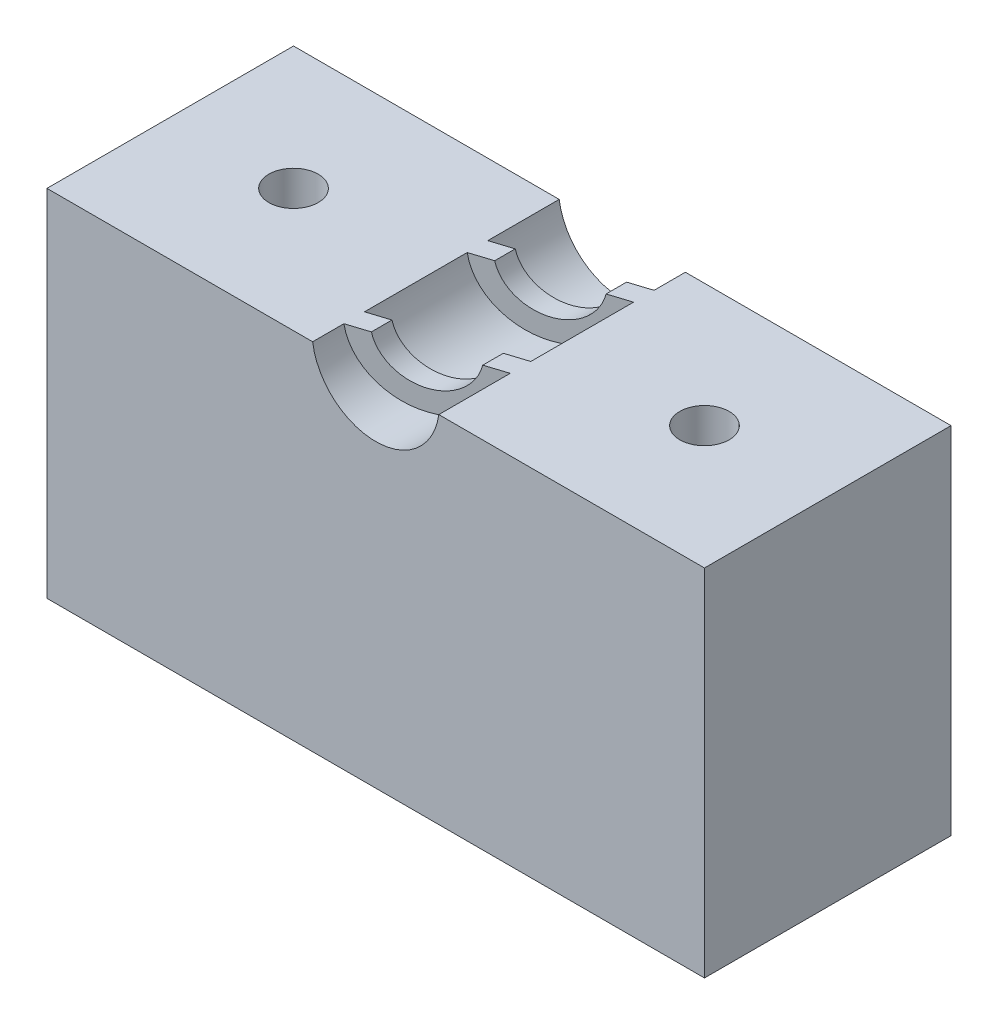
ISO-10303-21;
HEADER;
FILE_DESCRIPTION(('STEP AP214'),'2;1');
FILE_NAME('part.step','',(''),(''),'','','');
FILE_SCHEMA(('AUTOMOTIVE_DESIGN { 1 0 10303 214 1 1 1 1 }'));
ENDSEC;
DATA;
#1=APPLICATION_CONTEXT('core data for automotive mechanical design processes');
#2=APPLICATION_PROTOCOL_DEFINITION('international standard','automotive_design',2000,#1);
#3=PRODUCT_CONTEXT('',#1,'mechanical');
#4=PRODUCT('Part','Part','',(#3));
#5=PRODUCT_RELATED_PRODUCT_CATEGORY('part','',(#4));
#6=PRODUCT_DEFINITION_FORMATION('','',#4);
#7=PRODUCT_DEFINITION_CONTEXT('part definition',#1,'design');
#8=PRODUCT_DEFINITION('design','',#6,#7);
#9=PRODUCT_DEFINITION_SHAPE('','',#8);
#10=(LENGTH_UNIT() NAMED_UNIT(*) SI_UNIT(.MILLI.,.METRE.));
#11=(NAMED_UNIT(*) PLANE_ANGLE_UNIT() SI_UNIT($,.RADIAN.));
#12=(NAMED_UNIT(*) SI_UNIT($,.STERADIAN.) SOLID_ANGLE_UNIT());
#13=UNCERTAINTY_MEASURE_WITH_UNIT(LENGTH_MEASURE(1.E-05),#10,'distance_accuracy_value','');
#14=(GEOMETRIC_REPRESENTATION_CONTEXT(3) GLOBAL_UNCERTAINTY_ASSIGNED_CONTEXT((#13)) GLOBAL_UNIT_ASSIGNED_CONTEXT((#10,
#11,#12)) REPRESENTATION_CONTEXT('',''));
#15=CARTESIAN_POINT('',(0.,0.,0.));
#16=DIRECTION('',(0.,0.,1.));
#17=DIRECTION('',(1.,0.,0.));
#18=AXIS2_PLACEMENT_3D('',#15,#16,#17);
#19=CARTESIAN_POINT('',(0.,0.,3.));
#20=DIRECTION('',(0.,0.,-1.));
#21=DIRECTION('',(-1.,0.,0.));
#22=AXIS2_PLACEMENT_3D('',#19,#20,#21);
#23=CYLINDRICAL_SURFACE('',#22,1.55);
#24=CARTESIAN_POINT('',(0.,0.,-3.));
#25=DIRECTION('',(0.,0.,1.));
#26=DIRECTION('',(1.,0.,0.));
#27=AXIS2_PLACEMENT_3D('',#24,#25,#26);
#28=CIRCLE('',#27,1.55);
#29=CARTESIAN_POINT('',(-1.53514305660554,-0.214092960547071,-3.));
#30=VERTEX_POINT('',#29);
#31=CARTESIAN_POINT('',(1.53514305660554,-0.214092960547071,-3.));
#32=VERTEX_POINT('',#31);
#33=EDGE_CURVE('E235',#30,#32,#28,.T.);
#34=ORIENTED_EDGE('',*,*,#33,.F.);
#35=DIRECTION('',(0.,0.,-1.));
#36=VECTOR('',#35,1.);
#37=CARTESIAN_POINT('',(-1.53514305660554,-0.214092960547071,3.));
#38=LINE('',#37,#36);
#39=CARTESIAN_POINT('',(-1.53514305660554,-0.214092960547072,-1.26125398185195));
#40=VERTEX_POINT('',#39);
#41=EDGE_CURVE('E209',#30,#40,#38,.F.);
#42=ORIENTED_EDGE('',*,*,#41,.T.);
#43=CARTESIAN_POINT('',(0.,0.,-1.75));
#44=DIRECTION('',(-0.303367903708314,0.,-0.952873504196451));
#45=DIRECTION('',(0.952873504196451,0.,-0.303367903708314));
#46=AXIS2_PLACEMENT_3D('',#43,#44,#45);
#47=ELLIPSE('',#46,1.62665872560608,1.55);
#48=CARTESIAN_POINT('',(1.53514305660553,-0.214092960547071,-2.23874601814805));
#49=VERTEX_POINT('',#48);
#50=EDGE_CURVE('E229',#49,#40,#47,.T.);
#51=ORIENTED_EDGE('',*,*,#50,.F.);
#52=DIRECTION('',(0.,0.,-1.));
#53=VECTOR('',#52,1.);
#54=CARTESIAN_POINT('',(1.53514305660554,-0.214092960547071,3.));
#55=LINE('',#54,#53);
#56=EDGE_CURVE('E61',#32,#49,#55,.F.);
#57=ORIENTED_EDGE('',*,*,#56,.F.);
#58=EDGE_LOOP('',(#34,#42,#51,#57));
#59=FACE_BOUND('',#58,.T.);
#60=ADVANCED_FACE('F38',(#59),#23,.F.);
#61=CARTESIAN_POINT('',(0.,0.,1.75));
#62=DIRECTION('',(0.303367903708314,0.,0.952873504196451));
#63=DIRECTION('',(0.952873504196451,0.,-0.303367903708314));
#64=AXIS2_PLACEMENT_3D('',#61,#62,#63);
#65=ELLIPSE('',#64,1.62665872560608,1.55);
#66=CARTESIAN_POINT('',(-1.53514305660554,-0.214092960547072,2.23874601814805));
#67=VERTEX_POINT('',#66);
#68=CARTESIAN_POINT('',(1.53514305660553,-0.214092960547071,1.26125398185195));
#69=VERTEX_POINT('',#68);
#70=EDGE_CURVE('E152',#67,#69,#65,.T.);
#71=ORIENTED_EDGE('',*,*,#70,.F.);
#72=CARTESIAN_POINT('',(-1.53514305660554,-0.214092960547071,3.));
#73=VERTEX_POINT('',#72);
#74=EDGE_CURVE('E213',#67,#73,#38,.F.);
#75=ORIENTED_EDGE('',*,*,#74,.T.);
#76=CARTESIAN_POINT('',(0.,0.,3.));
#77=DIRECTION('',(0.,0.,1.));
#78=DIRECTION('',(1.,0.,0.));
#79=AXIS2_PLACEMENT_3D('',#76,#77,#78);
#80=CIRCLE('',#79,1.55);
#81=CARTESIAN_POINT('',(1.53514305660554,-0.214092960547071,3.));
#82=VERTEX_POINT('',#81);
#83=EDGE_CURVE('E236',#73,#82,#80,.T.);
#84=ORIENTED_EDGE('',*,*,#83,.T.);
#85=EDGE_CURVE('E201',#69,#82,#55,.F.);
#86=ORIENTED_EDGE('',*,*,#85,.F.);
#87=EDGE_LOOP('',(#71,#75,#84,#86));
#88=FACE_BOUND('',#87,.T.);
#89=ADVANCED_FACE('F281',(#88),#23,.F.);
#90=CARTESIAN_POINT('',(0.,0.,3.));
#91=DIRECTION('',(0.,0.,-1.));
#92=DIRECTION('',(-1.,0.,0.));
#93=AXIS2_PLACEMENT_3D('',#90,#91,#92);
#94=PLANE('',#93);
#95=DIRECTION('',(-1.,0.,0.));
#96=VECTOR('',#95,1.);
#97=CARTESIAN_POINT('',(0.,-0.214092960547071,3.));
#98=LINE('',#97,#96);
#99=CARTESIAN_POINT('',(-8.,-0.214092960547072,3.));
#100=VERTEX_POINT('',#99);
#101=EDGE_CURVE('E149',#73,#100,#98,.T.);
#102=ORIENTED_EDGE('',*,*,#101,.T.);
#103=DIRECTION('',(0.,-1.,0.));
#104=VECTOR('',#103,1.);
#105=CARTESIAN_POINT('',(-8.,-8.,3.));
#106=LINE('',#105,#104);
#107=CARTESIAN_POINT('',(-8.,-8.85500000008005,3.));
#108=VERTEX_POINT('',#107);
#109=EDGE_CURVE('E141',#100,#108,#106,.T.);
#110=ORIENTED_EDGE('',*,*,#109,.T.);
#111=DIRECTION('',(-1.,0.,0.));
#112=VECTOR('',#111,1.);
#113=CARTESIAN_POINT('',(7.99999999999999,-8.85500000008004,3.));
#114=LINE('',#113,#112);
#115=CARTESIAN_POINT('',(8.,-8.85500000008004,3.));
#116=VERTEX_POINT('',#115);
#117=EDGE_CURVE('E146',#116,#108,#114,.T.);
#118=ORIENTED_EDGE('',*,*,#117,.F.);
#119=DIRECTION('',(0.,1.,0.));
#120=VECTOR('',#119,1.);
#121=CARTESIAN_POINT('',(8.,-8.,3.));
#122=LINE('',#121,#120);
#123=CARTESIAN_POINT('',(8.,-0.214092960547071,3.));
#124=VERTEX_POINT('',#123);
#125=EDGE_CURVE('E153',#116,#124,#122,.T.);
#126=ORIENTED_EDGE('',*,*,#125,.T.);
#127=DIRECTION('',(1.,0.,0.));
#128=VECTOR('',#127,1.);
#129=CARTESIAN_POINT('',(0.,-0.214092960547071,3.));
#130=LINE('',#129,#128);
#131=EDGE_CURVE('E179',#82,#124,#130,.T.);
#132=ORIENTED_EDGE('',*,*,#131,.F.);
#133=ORIENTED_EDGE('',*,*,#83,.F.);
#134=EDGE_LOOP('',(#102,#110,#118,#126,#132,#133));
#135=FACE_BOUND('',#134,.T.);
#136=ADVANCED_FACE('F143',(#135),#94,.F.);
#137=CARTESIAN_POINT('',(0.,0.,-3.));
#138=DIRECTION('',(0.,0.,-1.));
#139=DIRECTION('',(-1.,0.,0.));
#140=AXIS2_PLACEMENT_3D('',#137,#138,#139);
#141=PLANE('',#140);
#142=DIRECTION('',(0.,-1.,0.));
#143=VECTOR('',#142,1.);
#144=CARTESIAN_POINT('',(-8.,-8.,-3.));
#145=LINE('',#144,#143);
#146=CARTESIAN_POINT('',(-8.,-0.214092960547072,-3.));
#147=VERTEX_POINT('',#146);
#148=CARTESIAN_POINT('',(-8.,-8.85500000008004,-3.));
#149=VERTEX_POINT('',#148);
#150=EDGE_CURVE('E159',#147,#149,#145,.T.);
#151=ORIENTED_EDGE('',*,*,#150,.F.);
#152=DIRECTION('',(-1.,0.,0.));
#153=VECTOR('',#152,1.);
#154=CARTESIAN_POINT('',(0.,-0.214092960547071,-3.));
#155=LINE('',#154,#153);
#156=EDGE_CURVE('E185',#30,#147,#155,.T.);
#157=ORIENTED_EDGE('',*,*,#156,.F.);
#158=ORIENTED_EDGE('',*,*,#33,.T.);
#159=DIRECTION('',(1.,0.,0.));
#160=VECTOR('',#159,1.);
#161=CARTESIAN_POINT('',(0.,-0.214092960547071,-3.));
#162=LINE('',#161,#160);
#163=CARTESIAN_POINT('',(8.,-0.214092960547071,-3.));
#164=VERTEX_POINT('',#163);
#165=EDGE_CURVE('E182',#32,#164,#162,.T.);
#166=ORIENTED_EDGE('',*,*,#165,.T.);
#167=DIRECTION('',(0.,1.,0.));
#168=VECTOR('',#167,1.);
#169=CARTESIAN_POINT('',(8.,-8.,-3.));
#170=LINE('',#169,#168);
#171=CARTESIAN_POINT('',(8.,-8.85500000008004,-3.));
#172=VERTEX_POINT('',#171);
#173=EDGE_CURVE('E239',#172,#164,#170,.T.);
#174=ORIENTED_EDGE('',*,*,#173,.F.);
#175=DIRECTION('',(1.,0.,0.));
#176=VECTOR('',#175,1.);
#177=CARTESIAN_POINT('',(-8.00000000000001,-8.85500000008005,-3.));
#178=LINE('',#177,#176);
#179=EDGE_CURVE('E164',#149,#172,#178,.T.);
#180=ORIENTED_EDGE('',*,*,#179,.F.);
#181=EDGE_LOOP('',(#151,#157,#158,#166,#174,#180));
#182=FACE_BOUND('',#181,.T.);
#183=ADVANCED_FACE('F293',(#182),#141,.T.);
#184=CARTESIAN_POINT('',(-8.,-8.,3.));
#185=DIRECTION('',(1.,0.,0.));
#186=DIRECTION('',(0.,0.,-1.));
#187=AXIS2_PLACEMENT_3D('',#184,#185,#186);
#188=PLANE('',#187);
#189=DIRECTION('',(0.,0.,1.));
#190=VECTOR('',#189,1.);
#191=CARTESIAN_POINT('',(-8.,-0.214092960547072,-3.));
#192=LINE('',#191,#190);
#193=EDGE_CURVE('E192',#147,#100,#192,.T.);
#194=ORIENTED_EDGE('',*,*,#193,.F.);
#195=ORIENTED_EDGE('',*,*,#150,.T.);
#196=DIRECTION('',(0.,0.,-1.));
#197=VECTOR('',#196,1.);
#198=CARTESIAN_POINT('',(-8.,-8.85500000008005,3.));
#199=LINE('',#198,#197);
#200=EDGE_CURVE('E156',#108,#149,#199,.T.);
#201=ORIENTED_EDGE('',*,*,#200,.F.);
#202=ORIENTED_EDGE('',*,*,#109,.F.);
#203=EDGE_LOOP('',(#194,#195,#201,#202));
#204=FACE_BOUND('',#203,.T.);
#205=ADVANCED_FACE('F157',(#204),#188,.F.);
#206=CARTESIAN_POINT('',(0.505874665567726,-11.4381719755756,1.58894385124934));
#207=DIRECTION('',(0.303367903708314,0.,0.952873504196451));
#208=DIRECTION('',(0.952873504196451,0.,-0.303367903708314));
#209=AXIS2_PLACEMENT_3D('',#206,#207,#208);
#210=PLANE('',#209);
#211=CARTESIAN_POINT('',(0.,0.,1.75));
#212=DIRECTION('',(0.303367903708314,0.,0.952873504196451));
#213=DIRECTION('',(-0.952873504196451,0.,0.303367903708314));
#214=AXIS2_PLACEMENT_3D('',#211,#212,#213);
#215=ELLIPSE('',#214,1.10193010444283,1.05);
#216=CARTESIAN_POINT('',(-1.02794173193046,-0.214092960547071,2.07726749875684));
#217=VERTEX_POINT('',#216);
#218=CARTESIAN_POINT('',(1.02794173193046,-0.214092960547071,1.42273250124316));
#219=VERTEX_POINT('',#218);
#220=EDGE_CURVE('E224',#217,#219,#215,.T.);
#221=ORIENTED_EDGE('',*,*,#220,.F.);
#222=DIRECTION('',(-0.952873504196451,0.,0.303367903708314));
#223=VECTOR('',#222,1.);
#224=CARTESIAN_POINT('',(0.505874665567725,-0.214092960547071,1.58894385124934));
#225=LINE('',#224,#223);
#226=EDGE_CURVE('E219',#217,#67,#225,.T.);
#227=ORIENTED_EDGE('',*,*,#226,.T.);
#228=ORIENTED_EDGE('',*,*,#70,.T.);
#229=DIRECTION('',(0.952873504196451,0.,-0.303367903708314));
#230=VECTOR('',#229,1.);
#231=CARTESIAN_POINT('',(0.505874665567726,-0.214092960547071,1.58894385124934));
#232=LINE('',#231,#230);
#233=EDGE_CURVE('E207',#219,#69,#232,.T.);
#234=ORIENTED_EDGE('',*,*,#233,.F.);
#235=EDGE_LOOP('',(#221,#227,#228,#234));
#236=FACE_BOUND('',#235,.T.);
#237=ADVANCED_FACE('F277',(#236),#210,.T.);
#238=CARTESIAN_POINT('',(-0.505874665567727,-11.4381719755756,-1.58894385124934));
#239=DIRECTION('',(-0.303367903708314,0.,-0.952873504196451));
#240=DIRECTION('',(-0.952873504196451,0.,0.303367903708314));
#241=AXIS2_PLACEMENT_3D('',#238,#239,#240);
#242=PLANE('',#241);
#243=ORIENTED_EDGE('',*,*,#50,.T.);
#244=DIRECTION('',(0.952873504196451,0.,-0.303367903708314));
#245=VECTOR('',#244,1.);
#246=CARTESIAN_POINT('',(-0.505874665567728,-0.214092960547071,-1.58894385124934));
#247=LINE('',#246,#245);
#248=CARTESIAN_POINT('',(-1.02794173193046,-0.214092960547071,-1.42273250124316));
#249=VERTEX_POINT('',#248);
#250=EDGE_CURVE('E12',#40,#249,#247,.T.);
#251=ORIENTED_EDGE('',*,*,#250,.T.);
#252=CARTESIAN_POINT('',(0.,0.,-1.75));
#253=DIRECTION('',(-0.303367903708314,0.,-0.952873504196451));
#254=DIRECTION('',(-0.952873504196451,0.,0.303367903708314));
#255=AXIS2_PLACEMENT_3D('',#252,#253,#254);
#256=ELLIPSE('',#255,1.10193010444283,1.05);
#257=CARTESIAN_POINT('',(1.02794173193046,-0.214092960547071,-2.07726749875684));
#258=VERTEX_POINT('',#257);
#259=EDGE_CURVE('E47',#258,#249,#256,.T.);
#260=ORIENTED_EDGE('',*,*,#259,.F.);
#261=DIRECTION('',(-0.952873504196451,0.,0.303367903708314));
#262=VECTOR('',#261,1.);
#263=CARTESIAN_POINT('',(-0.505874665567727,-0.214092960547071,-1.58894385124934));
#264=LINE('',#263,#262);
#265=EDGE_CURVE('E251',#49,#258,#264,.T.);
#266=ORIENTED_EDGE('',*,*,#265,.F.);
#267=EDGE_LOOP('',(#243,#251,#260,#266));
#268=FACE_BOUND('',#267,.T.);
#269=ADVANCED_FACE('F299',(#268),#242,.T.);
#270=CARTESIAN_POINT('',(8.,-8.,3.));
#271=DIRECTION('',(-1.,0.,0.));
#272=DIRECTION('',(0.,0.,1.));
#273=AXIS2_PLACEMENT_3D('',#270,#271,#272);
#274=PLANE('',#273);
#275=ORIENTED_EDGE('',*,*,#173,.T.);
#276=DIRECTION('',(0.,0.,1.));
#277=VECTOR('',#276,1.);
#278=CARTESIAN_POINT('',(8.,-0.214092960547071,-3.));
#279=LINE('',#278,#277);
#280=EDGE_CURVE('E194',#164,#124,#279,.T.);
#281=ORIENTED_EDGE('',*,*,#280,.T.);
#282=ORIENTED_EDGE('',*,*,#125,.F.);
#283=DIRECTION('',(0.,0.,1.));
#284=VECTOR('',#283,1.);
#285=CARTESIAN_POINT('',(8.,-8.85500000008004,-3.));
#286=LINE('',#285,#284);
#287=EDGE_CURVE('E168',#172,#116,#286,.T.);
#288=ORIENTED_EDGE('',*,*,#287,.F.);
#289=EDGE_LOOP('',(#275,#281,#282,#288));
#290=FACE_BOUND('',#289,.T.);
#291=ADVANCED_FACE('F40',(#290),#274,.F.);
#292=CARTESIAN_POINT('',(0.,0.,-3.));
#293=DIRECTION('',(0.,0.,1.));
#294=DIRECTION('',(1.,0.,0.));
#295=AXIS2_PLACEMENT_3D('',#292,#293,#294);
#296=CYLINDRICAL_SURFACE('',#295,1.05);
#297=DIRECTION('',(0.,0.,1.));
#298=VECTOR('',#297,1.);
#299=CARTESIAN_POINT('',(-1.02794173193046,-0.214092960547071,-3.));
#300=LINE('',#299,#298);
#301=CARTESIAN_POINT('',(-1.02794173193046,-0.214092960547071,1.57726749875684));
#302=VERTEX_POINT('',#301);
#303=EDGE_CURVE('E188',#302,#217,#300,.T.);
#304=ORIENTED_EDGE('',*,*,#303,.T.);
#305=ORIENTED_EDGE('',*,*,#220,.T.);
#306=DIRECTION('',(0.,0.,1.));
#307=VECTOR('',#306,1.);
#308=CARTESIAN_POINT('',(1.02794173193046,-0.214092960547071,-3.));
#309=LINE('',#308,#307);
#310=CARTESIAN_POINT('',(1.02794173193046,-0.214092960547071,0.92273250124316));
#311=VERTEX_POINT('',#310);
#312=EDGE_CURVE('E187',#311,#219,#309,.T.);
#313=ORIENTED_EDGE('',*,*,#312,.F.);
#314=CARTESIAN_POINT('',(0.,0.,1.25));
#315=DIRECTION('',(0.303367903708314,0.,0.952873504196451));
#316=DIRECTION('',(-0.952873504196451,0.,0.303367903708314));
#317=AXIS2_PLACEMENT_3D('',#314,#315,#316);
#318=ELLIPSE('',#317,1.10193010444283,1.05);
#319=EDGE_CURVE('E226',#302,#311,#318,.T.);
#320=ORIENTED_EDGE('',*,*,#319,.F.);
#321=EDGE_LOOP('',(#304,#305,#313,#320));
#322=FACE_BOUND('',#321,.T.);
#323=ADVANCED_FACE('F266',(#322),#296,.F.);
#324=CARTESIAN_POINT('',(0.,-0.214092960547071,-3.));
#325=DIRECTION('',(0.,1.,0.));
#326=DIRECTION('',(-1.,0.,0.));
#327=AXIS2_PLACEMENT_3D('',#324,#325,#326);
#328=PLANE('',#327);
#329=CARTESIAN_POINT('',(-5.,-0.214092960547072,0.));
#330=DIRECTION('',(0.,1.,0.));
#331=DIRECTION('',(-1.,0.,0.));
#332=AXIS2_PLACEMENT_3D('',#329,#330,#331);
#333=CIRCLE('',#332,0.6);
#334=CARTESIAN_POINT('',(-5.6,-0.214092960547072,0.));
#335=VERTEX_POINT('',#334);
#336=EDGE_CURVE('E42',#335,#335,#333,.T.);
#337=ORIENTED_EDGE('',*,*,#336,.F.);
#338=EDGE_LOOP('',(#337));
#339=FACE_BOUND('',#338,.T.);
#340=ORIENTED_EDGE('',*,*,#226,.F.);
#341=ORIENTED_EDGE('',*,*,#303,.F.);
#342=DIRECTION('',(-0.952873504196451,0.,0.303367903708314));
#343=VECTOR('',#342,1.);
#344=CARTESIAN_POINT('',(0.361339046834089,-0.214092960547071,1.13495989374953));
#345=LINE('',#344,#343);
#346=CARTESIAN_POINT('',(-1.53514305660554,-0.214092960547071,1.73874601814805));
#347=VERTEX_POINT('',#346);
#348=EDGE_CURVE('E217',#302,#347,#345,.T.);
#349=ORIENTED_EDGE('',*,*,#348,.T.);
#350=CARTESIAN_POINT('',(-1.53514305660554,-0.214092960547072,-0.76125398185195));
#351=VERTEX_POINT('',#350);
#352=EDGE_CURVE('E214',#351,#347,#38,.F.);
#353=ORIENTED_EDGE('',*,*,#352,.F.);
#354=DIRECTION('',(-0.952873504196451,0.,0.303367903708314));
#355=VECTOR('',#354,1.);
#356=CARTESIAN_POINT('',(-0.361339046834092,-0.214092960547071,-1.13495989374953));
#357=LINE('',#356,#355);
#358=CARTESIAN_POINT('',(-1.02794173193046,-0.214092960547071,-0.922732501243162));
#359=VERTEX_POINT('',#358);
#360=EDGE_CURVE('E212',#359,#351,#357,.T.);
#361=ORIENTED_EDGE('',*,*,#360,.F.);
#362=EDGE_CURVE('E191',#249,#359,#300,.T.);
#363=ORIENTED_EDGE('',*,*,#362,.F.);
#364=ORIENTED_EDGE('',*,*,#250,.F.);
#365=ORIENTED_EDGE('',*,*,#41,.F.);
#366=ORIENTED_EDGE('',*,*,#156,.T.);
#367=ORIENTED_EDGE('',*,*,#193,.T.);
#368=ORIENTED_EDGE('',*,*,#101,.F.);
#369=ORIENTED_EDGE('',*,*,#74,.F.);
#370=EDGE_LOOP('',(#340,#341,#349,#353,#361,#363,#364,#365,#366,#367,#368,#369));
#371=FACE_BOUND('',#370,.T.);
#372=ADVANCED_FACE('F262',(#339,#371),#328,.T.);
#373=CARTESIAN_POINT('',(0.,-0.214092960547071,-3.));
#374=DIRECTION('',(0.,-1.,0.));
#375=DIRECTION('',(1.,0.,0.));
#376=AXIS2_PLACEMENT_3D('',#373,#374,#375);
#377=PLANE('',#376);
#378=CARTESIAN_POINT('',(5.,-0.214092960547071,0.));
#379=DIRECTION('',(0.,-1.,0.));
#380=DIRECTION('',(1.,0.,0.));
#381=AXIS2_PLACEMENT_3D('',#378,#379,#380);
#382=CIRCLE('',#381,0.6);
#383=CARTESIAN_POINT('',(5.6,-0.214092960547071,0.));
#384=VERTEX_POINT('',#383);
#385=EDGE_CURVE('E163',#384,#384,#382,.T.);
#386=ORIENTED_EDGE('',*,*,#385,.T.);
#387=EDGE_LOOP('',(#386));
#388=FACE_BOUND('',#387,.T.);
#389=ORIENTED_EDGE('',*,*,#85,.T.);
#390=ORIENTED_EDGE('',*,*,#131,.T.);
#391=ORIENTED_EDGE('',*,*,#280,.F.);
#392=ORIENTED_EDGE('',*,*,#165,.F.);
#393=ORIENTED_EDGE('',*,*,#56,.T.);
#394=ORIENTED_EDGE('',*,*,#265,.T.);
#395=CARTESIAN_POINT('',(1.02794173193046,-0.214092960547071,-1.57726749875684));
#396=VERTEX_POINT('',#395);
#397=EDGE_CURVE('E55',#258,#396,#309,.T.);
#398=ORIENTED_EDGE('',*,*,#397,.T.);
#399=DIRECTION('',(0.952873504196451,0.,-0.303367903708314));
#400=VECTOR('',#399,1.);
#401=CARTESIAN_POINT('',(-0.361339046834091,-0.214092960547071,-1.13495989374953));
#402=LINE('',#401,#400);
#403=CARTESIAN_POINT('',(1.53514305660554,-0.214092960547071,-1.73874601814805));
#404=VERTEX_POINT('',#403);
#405=EDGE_CURVE('E200',#396,#404,#402,.T.);
#406=ORIENTED_EDGE('',*,*,#405,.T.);
#407=CARTESIAN_POINT('',(1.53514305660554,-0.214092960547071,0.761253981851949));
#408=VERTEX_POINT('',#407);
#409=EDGE_CURVE('E202',#404,#408,#55,.F.);
#410=ORIENTED_EDGE('',*,*,#409,.T.);
#411=DIRECTION('',(0.952873504196451,0.,-0.303367903708314));
#412=VECTOR('',#411,1.);
#413=CARTESIAN_POINT('',(0.36133904683409,-0.214092960547071,1.13495989374953));
#414=LINE('',#413,#412);
#415=EDGE_CURVE('E204',#311,#408,#414,.T.);
#416=ORIENTED_EDGE('',*,*,#415,.F.);
#417=ORIENTED_EDGE('',*,*,#312,.T.);
#418=ORIENTED_EDGE('',*,*,#233,.T.);
#419=EDGE_LOOP('',(#389,#390,#391,#392,#393,#394,#398,#406,#410,#416,#417,#418));
#420=FACE_BOUND('',#419,.T.);
#421=ADVANCED_FACE('F265',(#388,#420),#377,.F.);
#422=CARTESIAN_POINT('',(0.,0.,-1.25));
#423=DIRECTION('',(0.303367903708314,0.,0.952873504196451));
#424=DIRECTION('',(-0.952873504196451,0.,0.303367903708314));
#425=AXIS2_PLACEMENT_3D('',#422,#423,#424);
#426=ELLIPSE('',#425,1.10193010444283,1.05);
#427=EDGE_CURVE('E222',#359,#396,#426,.T.);
#428=ORIENTED_EDGE('',*,*,#427,.T.);
#429=ORIENTED_EDGE('',*,*,#397,.F.);
#430=ORIENTED_EDGE('',*,*,#259,.T.);
#431=ORIENTED_EDGE('',*,*,#362,.T.);
#432=EDGE_LOOP('',(#428,#429,#430,#431));
#433=FACE_BOUND('',#432,.T.);
#434=ADVANCED_FACE('F302',(#433),#296,.F.);
#435=CARTESIAN_POINT('',(0.36133904683409,-11.4381719755756,1.13495989374953));
#436=DIRECTION('',(0.303367903708314,0.,0.952873504196451));
#437=DIRECTION('',(0.952873504196451,0.,-0.303367903708314));
#438=AXIS2_PLACEMENT_3D('',#435,#436,#437);
#439=PLANE('',#438);
#440=ORIENTED_EDGE('',*,*,#348,.F.);
#441=ORIENTED_EDGE('',*,*,#319,.T.);
#442=ORIENTED_EDGE('',*,*,#415,.T.);
#443=CARTESIAN_POINT('',(0.,0.,1.25));
#444=DIRECTION('',(0.303367903708314,0.,0.952873504196451));
#445=DIRECTION('',(0.952873504196451,0.,-0.303367903708314));
#446=AXIS2_PLACEMENT_3D('',#443,#444,#445);
#447=ELLIPSE('',#446,1.62665872560608,1.55);
#448=EDGE_CURVE('E248',#347,#408,#447,.T.);
#449=ORIENTED_EDGE('',*,*,#448,.F.);
#450=EDGE_LOOP('',(#440,#441,#442,#449));
#451=FACE_BOUND('',#450,.T.);
#452=ADVANCED_FACE('F288',(#451),#439,.F.);
#453=CARTESIAN_POINT('',(-0.361339046834091,-11.4381719755756,-1.13495989374953));
#454=DIRECTION('',(0.303367903708314,0.,0.952873504196451));
#455=DIRECTION('',(0.952873504196451,0.,-0.303367903708314));
#456=AXIS2_PLACEMENT_3D('',#453,#454,#455);
#457=PLANE('',#456);
#458=ORIENTED_EDGE('',*,*,#427,.F.);
#459=ORIENTED_EDGE('',*,*,#360,.T.);
#460=CARTESIAN_POINT('',(0.,0.,-1.25));
#461=DIRECTION('',(0.303367903708314,0.,0.952873504196451));
#462=DIRECTION('',(0.952873504196451,0.,-0.303367903708314));
#463=AXIS2_PLACEMENT_3D('',#460,#461,#462);
#464=ELLIPSE('',#463,1.62665872560608,1.55);
#465=EDGE_CURVE('E232',#351,#404,#464,.T.);
#466=ORIENTED_EDGE('',*,*,#465,.T.);
#467=ORIENTED_EDGE('',*,*,#405,.F.);
#468=EDGE_LOOP('',(#458,#459,#466,#467));
#469=FACE_BOUND('',#468,.T.);
#470=ADVANCED_FACE('F307',(#469),#457,.T.);
#471=ORIENTED_EDGE('',*,*,#465,.F.);
#472=ORIENTED_EDGE('',*,*,#352,.T.);
#473=ORIENTED_EDGE('',*,*,#448,.T.);
#474=ORIENTED_EDGE('',*,*,#409,.F.);
#475=EDGE_LOOP('',(#471,#472,#473,#474));
#476=FACE_BOUND('',#475,.T.);
#477=ADVANCED_FACE('F290',(#476),#23,.F.);
#478=CARTESIAN_POINT('',(5.,-8.,0.));
#479=DIRECTION('',(0.,1.,0.));
#480=DIRECTION('',(0.,0.,1.));
#481=AXIS2_PLACEMENT_3D('',#478,#479,#480);
#482=CYLINDRICAL_SURFACE('',#481,0.6);
#483=ORIENTED_EDGE('',*,*,#385,.F.);
#484=EDGE_LOOP('',(#483));
#485=FACE_BOUND('',#484,.T.);
#486=CARTESIAN_POINT('',(5.,-8.85500000008004,0.));
#487=DIRECTION('',(0.,-1.,0.));
#488=DIRECTION('',(1.,0.,0.));
#489=AXIS2_PLACEMENT_3D('',#486,#487,#488);
#490=CIRCLE('',#489,0.6);
#491=CARTESIAN_POINT('',(5.6,-8.85500000008004,0.));
#492=VERTEX_POINT('',#491);
#493=EDGE_CURVE('E173',#492,#492,#490,.T.);
#494=ORIENTED_EDGE('',*,*,#493,.T.);
#495=EDGE_LOOP('',(#494));
#496=FACE_BOUND('',#495,.T.);
#497=ADVANCED_FACE('F314',(#485,#496),#482,.F.);
#498=CARTESIAN_POINT('',(-5.,-8.,0.));
#499=DIRECTION('',(0.,1.,0.));
#500=DIRECTION('',(0.,0.,1.));
#501=AXIS2_PLACEMENT_3D('',#498,#499,#500);
#502=CYLINDRICAL_SURFACE('',#501,0.6);
#503=ORIENTED_EDGE('',*,*,#336,.T.);
#504=EDGE_LOOP('',(#503));
#505=FACE_BOUND('',#504,.T.);
#506=CARTESIAN_POINT('',(-5.,-8.85500000008004,0.));
#507=DIRECTION('',(0.,-1.,0.));
#508=DIRECTION('',(1.,0.,0.));
#509=AXIS2_PLACEMENT_3D('',#506,#507,#508);
#510=CIRCLE('',#509,0.6);
#511=CARTESIAN_POINT('',(-4.4,-8.85500000008004,0.));
#512=VERTEX_POINT('',#511);
#513=EDGE_CURVE('E169',#512,#512,#510,.T.);
#514=ORIENTED_EDGE('',*,*,#513,.T.);
#515=EDGE_LOOP('',(#514));
#516=FACE_BOUND('',#515,.T.);
#517=ADVANCED_FACE('F259',(#505,#516),#502,.F.);
#518=CARTESIAN_POINT('',(27.7477781677913,-8.85500000008003,-11.));
#519=DIRECTION('',(0.,-1.,0.));
#520=DIRECTION('',(-1.,0.,0.));
#521=AXIS2_PLACEMENT_3D('',#518,#519,#520);
#522=PLANE('',#521);
#523=ORIENTED_EDGE('',*,*,#493,.F.);
#524=EDGE_LOOP('',(#523));
#525=FACE_BOUND('',#524,.T.);
#526=ORIENTED_EDGE('',*,*,#513,.F.);
#527=EDGE_LOOP('',(#526));
#528=FACE_BOUND('',#527,.T.);
#529=ORIENTED_EDGE('',*,*,#117,.T.);
#530=ORIENTED_EDGE('',*,*,#200,.T.);
#531=ORIENTED_EDGE('',*,*,#179,.T.);
#532=ORIENTED_EDGE('',*,*,#287,.T.);
#533=EDGE_LOOP('',(#529,#530,#531,#532));
#534=FACE_BOUND('',#533,.T.);
#535=ADVANCED_FACE('F166',(#525,#528,#534),#522,.T.);
#536=CLOSED_SHELL('',(#60,#89,#136,#183,#205,#237,#269,#291,#323,#372,#421,#434,#452,#470,#477,
#497,#517,#535));
#537=MANIFOLD_SOLID_BREP('B2',#536);
#538=ADVANCED_BREP_SHAPE_REPRESENTATION('',(#18,#537),#14);
#539=SHAPE_DEFINITION_REPRESENTATION(#9,#538);
ENDSEC;
END-ISO-10303-21;
